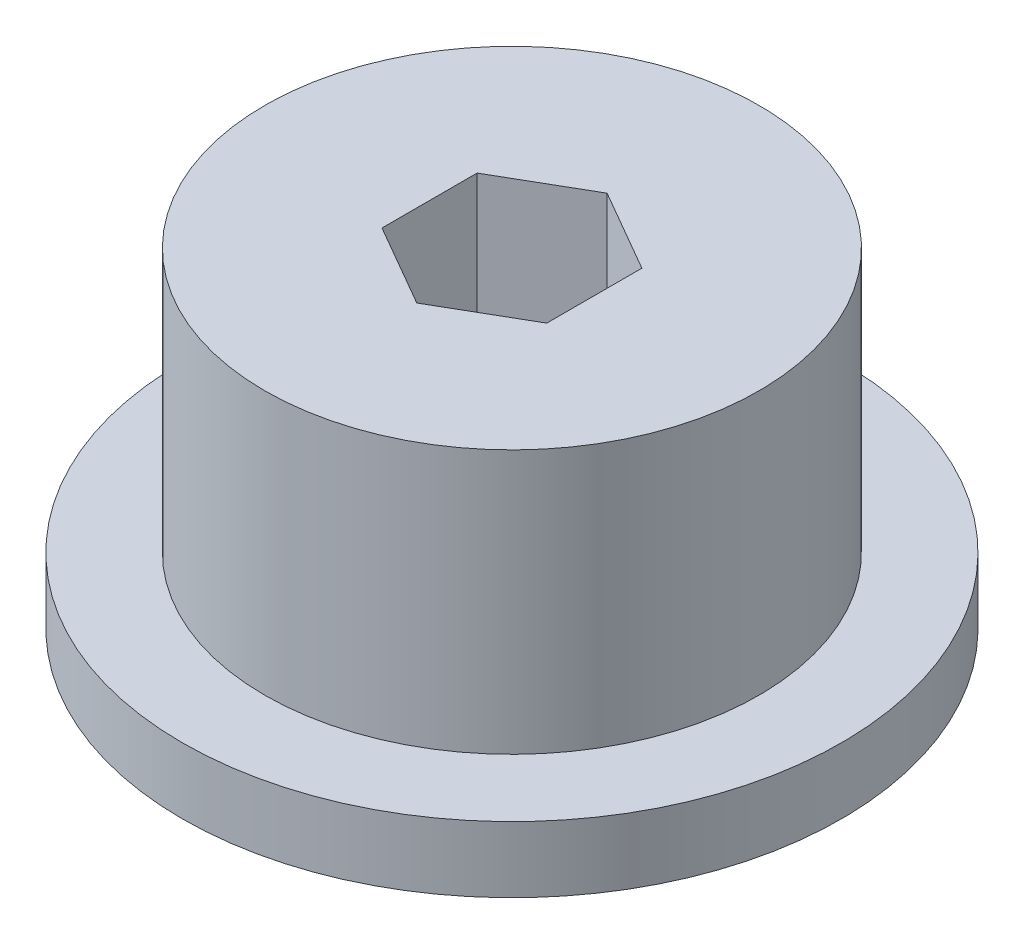
ISO-10303-21;
HEADER;
FILE_DESCRIPTION(('STEP AP214'),'2;1');
FILE_NAME('part.step','',(''),(''),'','','');
FILE_SCHEMA(('AUTOMOTIVE_DESIGN { 1 0 10303 214 1 1 1 1 }'));
ENDSEC;
DATA;
#1=APPLICATION_CONTEXT('core data for automotive mechanical design processes');
#2=APPLICATION_PROTOCOL_DEFINITION('international standard','automotive_design',2000,#1);
#3=PRODUCT_CONTEXT('',#1,'mechanical');
#4=PRODUCT('Part','Part','',(#3));
#5=PRODUCT_RELATED_PRODUCT_CATEGORY('part','',(#4));
#6=PRODUCT_DEFINITION_FORMATION('','',#4);
#7=PRODUCT_DEFINITION_CONTEXT('part definition',#1,'design');
#8=PRODUCT_DEFINITION('design','',#6,#7);
#9=PRODUCT_DEFINITION_SHAPE('','',#8);
#10=(LENGTH_UNIT() NAMED_UNIT(*) SI_UNIT(.MILLI.,.METRE.));
#11=(NAMED_UNIT(*) PLANE_ANGLE_UNIT() SI_UNIT($,.RADIAN.));
#12=(NAMED_UNIT(*) SI_UNIT($,.STERADIAN.) SOLID_ANGLE_UNIT());
#13=UNCERTAINTY_MEASURE_WITH_UNIT(LENGTH_MEASURE(1.E-05),#10,'distance_accuracy_value','');
#14=(GEOMETRIC_REPRESENTATION_CONTEXT(3) GLOBAL_UNCERTAINTY_ASSIGNED_CONTEXT((#13)) GLOBAL_UNIT_ASSIGNED_CONTEXT((#10,
#11,#12)) REPRESENTATION_CONTEXT('',''));
#15=CARTESIAN_POINT('',(0.,0.,0.));
#16=DIRECTION('',(0.,0.,1.));
#17=DIRECTION('',(1.,0.,0.));
#18=AXIS2_PLACEMENT_3D('',#15,#16,#17);
#19=CARTESIAN_POINT('',(0.,2.,0.));
#20=DIRECTION('',(0.,-1.,0.));
#21=DIRECTION('',(0.,0.,-1.));
#22=AXIS2_PLACEMENT_3D('',#19,#20,#21);
#23=CYLINDRICAL_SURFACE('',#22,10.);
#24=CARTESIAN_POINT('',(0.,2.,0.));
#25=DIRECTION('',(0.,1.,0.));
#26=DIRECTION('',(0.,0.,1.));
#27=AXIS2_PLACEMENT_3D('',#24,#25,#26);
#28=CIRCLE('',#27,10.);
#29=CARTESIAN_POINT('',(0.,2.,10.));
#30=VERTEX_POINT('',#29);
#31=EDGE_CURVE('E54',#30,#30,#28,.T.);
#32=ORIENTED_EDGE('',*,*,#31,.F.);
#33=EDGE_LOOP('',(#32));
#34=FACE_BOUND('',#33,.T.);
#35=CARTESIAN_POINT('',(0.,0.,0.));
#36=DIRECTION('',(0.,1.,0.));
#37=DIRECTION('',(0.,0.,1.));
#38=AXIS2_PLACEMENT_3D('',#35,#36,#37);
#39=CIRCLE('',#38,10.);
#40=CARTESIAN_POINT('',(0.,0.,10.));
#41=VERTEX_POINT('',#40);
#42=EDGE_CURVE('E48',#41,#41,#39,.T.);
#43=ORIENTED_EDGE('',*,*,#42,.T.);
#44=EDGE_LOOP('',(#43));
#45=FACE_BOUND('',#44,.T.);
#46=ADVANCED_FACE('F45',(#34,#45),#23,.T.);
#47=CARTESIAN_POINT('',(0.,2.,0.));
#48=DIRECTION('',(0.,1.,0.));
#49=DIRECTION('',(0.,0.,1.));
#50=AXIS2_PLACEMENT_3D('',#47,#48,#49);
#51=PLANE('',#50);
#52=CARTESIAN_POINT('',(0.,2.,0.));
#53=DIRECTION('',(0.,1.,0.));
#54=DIRECTION('',(0.,0.,1.));
#55=AXIS2_PLACEMENT_3D('',#52,#53,#54);
#56=CIRCLE('',#55,7.5);
#57=CARTESIAN_POINT('',(0.,2.,7.5));
#58=VERTEX_POINT('',#57);
#59=EDGE_CURVE('E11',#58,#58,#56,.T.);
#60=ORIENTED_EDGE('',*,*,#59,.F.);
#61=EDGE_LOOP('',(#60));
#62=FACE_BOUND('',#61,.T.);
#63=ORIENTED_EDGE('',*,*,#31,.T.);
#64=EDGE_LOOP('',(#63));
#65=FACE_BOUND('',#64,.T.);
#66=ADVANCED_FACE('F176',(#62,#65),#51,.T.);
#67=CARTESIAN_POINT('',(0.,0.,0.));
#68=DIRECTION('',(0.,1.,0.));
#69=DIRECTION('',(0.,0.,1.));
#70=AXIS2_PLACEMENT_3D('',#67,#68,#69);
#71=PLANE('',#70);
#72=DIRECTION('',(-0.866025403784439,0.,0.5));
#73=VECTOR('',#72,1.);
#74=CARTESIAN_POINT('',(0.,0.,2.88675134594813));
#75=LINE('',#74,#73);
#76=CARTESIAN_POINT('',(2.5,0.,1.44337567297407));
#77=VERTEX_POINT('',#76);
#78=CARTESIAN_POINT('',(0.,0.,2.88675134594813));
#79=VERTEX_POINT('',#78);
#80=EDGE_CURVE('E123',#77,#79,#75,.T.);
#81=ORIENTED_EDGE('',*,*,#80,.F.);
#82=DIRECTION('',(0.,0.,1.));
#83=VECTOR('',#82,1.);
#84=CARTESIAN_POINT('',(2.5,0.,1.44337567297407));
#85=LINE('',#84,#83);
#86=CARTESIAN_POINT('',(2.5,0.,-1.44337567297406));
#87=VERTEX_POINT('',#86);
#88=EDGE_CURVE('E102',#87,#77,#85,.T.);
#89=ORIENTED_EDGE('',*,*,#88,.F.);
#90=DIRECTION('',(0.866025403784438,0.,0.500000000000001));
#91=VECTOR('',#90,1.);
#92=CARTESIAN_POINT('',(2.5,0.,-1.44337567297406));
#93=LINE('',#92,#91);
#94=CARTESIAN_POINT('',(0.,0.,-2.88675134594813));
#95=VERTEX_POINT('',#94);
#96=EDGE_CURVE('E112',#95,#87,#93,.T.);
#97=ORIENTED_EDGE('',*,*,#96,.F.);
#98=DIRECTION('',(0.866025403784439,0.,-0.5));
#99=VECTOR('',#98,1.);
#100=CARTESIAN_POINT('',(0.,0.,-2.88675134594813));
#101=LINE('',#100,#99);
#102=CARTESIAN_POINT('',(-2.5,0.,-1.44337567297407));
#103=VERTEX_POINT('',#102);
#104=EDGE_CURVE('E62',#103,#95,#101,.T.);
#105=ORIENTED_EDGE('',*,*,#104,.F.);
#106=DIRECTION('',(0.,0.,-1.));
#107=VECTOR('',#106,1.);
#108=CARTESIAN_POINT('',(-2.5,0.,-1.44337567297407));
#109=LINE('',#108,#107);
#110=CARTESIAN_POINT('',(-2.5,0.,1.44337567297406));
#111=VERTEX_POINT('',#110);
#112=EDGE_CURVE('E273',#111,#103,#109,.T.);
#113=ORIENTED_EDGE('',*,*,#112,.F.);
#114=DIRECTION('',(-0.866025403784439,0.,-0.5));
#115=VECTOR('',#114,1.);
#116=CARTESIAN_POINT('',(-2.5,0.,1.44337567297406));
#117=LINE('',#116,#115);
#118=EDGE_CURVE('E130',#79,#111,#117,.T.);
#119=ORIENTED_EDGE('',*,*,#118,.F.);
#120=EDGE_LOOP('',(#81,#89,#97,#105,#113,#119));
#121=FACE_BOUND('',#120,.T.);
#122=ORIENTED_EDGE('',*,*,#42,.F.);
#123=EDGE_LOOP('',(#122));
#124=FACE_BOUND('',#123,.T.);
#125=ADVANCED_FACE('F119',(#121,#124),#71,.F.);
#126=CARTESIAN_POINT('',(0.,10.,0.));
#127=DIRECTION('',(0.,-1.,0.));
#128=DIRECTION('',(0.,0.,-1.));
#129=AXIS2_PLACEMENT_3D('',#126,#127,#128);
#130=CYLINDRICAL_SURFACE('',#129,7.5);
#131=CARTESIAN_POINT('',(0.,10.,0.));
#132=DIRECTION('',(0.,1.,0.));
#133=DIRECTION('',(0.,0.,1.));
#134=AXIS2_PLACEMENT_3D('',#131,#132,#133);
#135=CIRCLE('',#134,7.5);
#136=CARTESIAN_POINT('',(0.,10.,7.5));
#137=VERTEX_POINT('',#136);
#138=EDGE_CURVE('E116',#137,#137,#135,.T.);
#139=ORIENTED_EDGE('',*,*,#138,.F.);
#140=EDGE_LOOP('',(#139));
#141=FACE_BOUND('',#140,.T.);
#142=ORIENTED_EDGE('',*,*,#59,.T.);
#143=EDGE_LOOP('',(#142));
#144=FACE_BOUND('',#143,.T.);
#145=ADVANCED_FACE('F175',(#141,#144),#130,.T.);
#146=CARTESIAN_POINT('',(0.,10.,0.));
#147=DIRECTION('',(0.,1.,0.));
#148=DIRECTION('',(0.,0.,1.));
#149=AXIS2_PLACEMENT_3D('',#146,#147,#148);
#150=PLANE('',#149);
#151=DIRECTION('',(0.,0.,-1.));
#152=VECTOR('',#151,1.);
#153=CARTESIAN_POINT('',(2.5,10.,1.44337567297407));
#154=LINE('',#153,#152);
#155=CARTESIAN_POINT('',(2.5,10.,1.44337567297407));
#156=VERTEX_POINT('',#155);
#157=CARTESIAN_POINT('',(2.5,10.,-1.44337567297406));
#158=VERTEX_POINT('',#157);
#159=EDGE_CURVE('E70',#156,#158,#154,.T.);
#160=ORIENTED_EDGE('',*,*,#159,.F.);
#161=DIRECTION('',(0.866025403784439,0.,-0.5));
#162=VECTOR('',#161,1.);
#163=CARTESIAN_POINT('',(0.,10.,2.88675134594813));
#164=LINE('',#163,#162);
#165=CARTESIAN_POINT('',(0.,10.,2.88675134594813));
#166=VERTEX_POINT('',#165);
#167=EDGE_CURVE('E109',#166,#156,#164,.T.);
#168=ORIENTED_EDGE('',*,*,#167,.F.);
#169=DIRECTION('',(0.866025403784439,0.,0.5));
#170=VECTOR('',#169,1.);
#171=CARTESIAN_POINT('',(-2.5,10.,1.44337567297406));
#172=LINE('',#171,#170);
#173=CARTESIAN_POINT('',(-2.5,10.,1.44337567297406));
#174=VERTEX_POINT('',#173);
#175=EDGE_CURVE('E144',#174,#166,#172,.T.);
#176=ORIENTED_EDGE('',*,*,#175,.F.);
#177=DIRECTION('',(0.,0.,1.));
#178=VECTOR('',#177,1.);
#179=CARTESIAN_POINT('',(-2.5,10.,-1.44337567297407));
#180=LINE('',#179,#178);
#181=CARTESIAN_POINT('',(-2.5,10.,-1.44337567297407));
#182=VERTEX_POINT('',#181);
#183=EDGE_CURVE('E140',#182,#174,#180,.T.);
#184=ORIENTED_EDGE('',*,*,#183,.F.);
#185=DIRECTION('',(-0.866025403784439,0.,0.5));
#186=VECTOR('',#185,1.);
#187=CARTESIAN_POINT('',(0.,10.,-2.88675134594813));
#188=LINE('',#187,#186);
#189=CARTESIAN_POINT('',(0.,10.,-2.88675134594813));
#190=VERTEX_POINT('',#189);
#191=EDGE_CURVE('E136',#190,#182,#188,.T.);
#192=ORIENTED_EDGE('',*,*,#191,.F.);
#193=DIRECTION('',(-0.866025403784438,0.,-0.500000000000001));
#194=VECTOR('',#193,1.);
#195=CARTESIAN_POINT('',(2.5,10.,-1.44337567297406));
#196=LINE('',#195,#194);
#197=EDGE_CURVE('E128',#158,#190,#196,.T.);
#198=ORIENTED_EDGE('',*,*,#197,.F.);
#199=EDGE_LOOP('',(#160,#168,#176,#184,#192,#198));
#200=FACE_BOUND('',#199,.T.);
#201=ORIENTED_EDGE('',*,*,#138,.T.);
#202=EDGE_LOOP('',(#201));
#203=FACE_BOUND('',#202,.T.);
#204=ADVANCED_FACE('F181',(#200,#203),#150,.T.);
#205=CARTESIAN_POINT('',(2.5,-0.000999999999999265,1.44337567297407));
#206=DIRECTION('',(1.,0.,0.));
#207=DIRECTION('',(0.,0.,-1.));
#208=AXIS2_PLACEMENT_3D('',#205,#206,#207);
#209=PLANE('',#208);
#210=ORIENTED_EDGE('',*,*,#88,.T.);
#211=DIRECTION('',(0.,1.,0.));
#212=VECTOR('',#211,1.);
#213=CARTESIAN_POINT('',(2.5,-0.000999999999999265,1.44337567297407));
#214=LINE('',#213,#212);
#215=EDGE_CURVE('E117',#77,#156,#214,.T.);
#216=ORIENTED_EDGE('',*,*,#215,.T.);
#217=ORIENTED_EDGE('',*,*,#159,.T.);
#218=DIRECTION('',(0.,1.,0.));
#219=VECTOR('',#218,1.);
#220=CARTESIAN_POINT('',(2.5,-0.000999999999999265,-1.44337567297406));
#221=LINE('',#220,#219);
#222=EDGE_CURVE('E98',#87,#158,#221,.T.);
#223=ORIENTED_EDGE('',*,*,#222,.F.);
#224=EDGE_LOOP('',(#210,#216,#217,#223));
#225=FACE_BOUND('',#224,.T.);
#226=ADVANCED_FACE('F100',(#225),#209,.F.);
#227=CARTESIAN_POINT('',(0.,-0.000999999999999265,2.88675134594813));
#228=DIRECTION('',(0.5,0.,0.866025403784439));
#229=DIRECTION('',(0.866025403784439,0.,-0.5));
#230=AXIS2_PLACEMENT_3D('',#227,#228,#229);
#231=PLANE('',#230);
#232=ORIENTED_EDGE('',*,*,#80,.T.);
#233=DIRECTION('',(0.,1.,0.));
#234=VECTOR('',#233,1.);
#235=CARTESIAN_POINT('',(0.,-0.000999999999999265,2.88675134594813));
#236=LINE('',#235,#234);
#237=EDGE_CURVE('E153',#79,#166,#236,.T.);
#238=ORIENTED_EDGE('',*,*,#237,.T.);
#239=ORIENTED_EDGE('',*,*,#167,.T.);
#240=ORIENTED_EDGE('',*,*,#215,.F.);
#241=EDGE_LOOP('',(#232,#238,#239,#240));
#242=FACE_BOUND('',#241,.T.);
#243=ADVANCED_FACE('F222',(#242),#231,.F.);
#244=CARTESIAN_POINT('',(-2.5,-0.000999999999999265,1.44337567297406));
#245=DIRECTION('',(-0.5,0.,0.866025403784439));
#246=DIRECTION('',(0.866025403784439,0.,0.5));
#247=AXIS2_PLACEMENT_3D('',#244,#245,#246);
#248=PLANE('',#247);
#249=ORIENTED_EDGE('',*,*,#118,.T.);
#250=DIRECTION('',(0.,1.,0.));
#251=VECTOR('',#250,1.);
#252=CARTESIAN_POINT('',(-2.5,-0.000999999999999265,1.44337567297406));
#253=LINE('',#252,#251);
#254=EDGE_CURVE('E156',#111,#174,#253,.T.);
#255=ORIENTED_EDGE('',*,*,#254,.T.);
#256=ORIENTED_EDGE('',*,*,#175,.T.);
#257=ORIENTED_EDGE('',*,*,#237,.F.);
#258=EDGE_LOOP('',(#249,#255,#256,#257));
#259=FACE_BOUND('',#258,.T.);
#260=ADVANCED_FACE('F231',(#259),#248,.F.);
#261=CARTESIAN_POINT('',(-2.5,-0.000999999999999265,-1.44337567297407));
#262=DIRECTION('',(-1.,0.,0.));
#263=DIRECTION('',(0.,0.,1.));
#264=AXIS2_PLACEMENT_3D('',#261,#262,#263);
#265=PLANE('',#264);
#266=ORIENTED_EDGE('',*,*,#112,.T.);
#267=DIRECTION('',(0.,1.,0.));
#268=VECTOR('',#267,1.);
#269=CARTESIAN_POINT('',(-2.5,-0.000999999999999265,-1.44337567297407));
#270=LINE('',#269,#268);
#271=EDGE_CURVE('E159',#103,#182,#270,.T.);
#272=ORIENTED_EDGE('',*,*,#271,.T.);
#273=ORIENTED_EDGE('',*,*,#183,.T.);
#274=ORIENTED_EDGE('',*,*,#254,.F.);
#275=EDGE_LOOP('',(#266,#272,#273,#274));
#276=FACE_BOUND('',#275,.T.);
#277=ADVANCED_FACE('F241',(#276),#265,.F.);
#278=CARTESIAN_POINT('',(0.,-0.000999999999999265,-2.88675134594813));
#279=DIRECTION('',(-0.5,0.,-0.866025403784439));
#280=DIRECTION('',(-0.866025403784439,0.,0.5));
#281=AXIS2_PLACEMENT_3D('',#278,#279,#280);
#282=PLANE('',#281);
#283=ORIENTED_EDGE('',*,*,#104,.T.);
#284=DIRECTION('',(0.,1.,0.));
#285=VECTOR('',#284,1.);
#286=CARTESIAN_POINT('',(0.,-0.000999999999999265,-2.88675134594813));
#287=LINE('',#286,#285);
#288=EDGE_CURVE('E108',#95,#190,#287,.T.);
#289=ORIENTED_EDGE('',*,*,#288,.T.);
#290=ORIENTED_EDGE('',*,*,#191,.T.);
#291=ORIENTED_EDGE('',*,*,#271,.F.);
#292=EDGE_LOOP('',(#283,#289,#290,#291));
#293=FACE_BOUND('',#292,.T.);
#294=ADVANCED_FACE('F251',(#293),#282,.F.);
#295=CARTESIAN_POINT('',(2.5,-0.000999999999999265,-1.44337567297406));
#296=DIRECTION('',(0.500000000000001,0.,-0.866025403784438));
#297=DIRECTION('',(-0.866025403784438,0.,-0.500000000000001));
#298=AXIS2_PLACEMENT_3D('',#295,#296,#297);
#299=PLANE('',#298);
#300=ORIENTED_EDGE('',*,*,#96,.T.);
#301=ORIENTED_EDGE('',*,*,#222,.T.);
#302=ORIENTED_EDGE('',*,*,#197,.T.);
#303=ORIENTED_EDGE('',*,*,#288,.F.);
#304=EDGE_LOOP('',(#300,#301,#302,#303));
#305=FACE_BOUND('',#304,.T.);
#306=ADVANCED_FACE('F113',(#305),#299,.F.);
#307=CLOSED_SHELL('',(#46,#66,#125,#145,#204,#226,#243,#260,#277,#294,#306));
#308=MANIFOLD_SOLID_BREP('B2',#307);
#309=ADVANCED_BREP_SHAPE_REPRESENTATION('',(#18,#308),#14);
#310=SHAPE_DEFINITION_REPRESENTATION(#9,#309);
ENDSEC;
END-ISO-10303-21;
